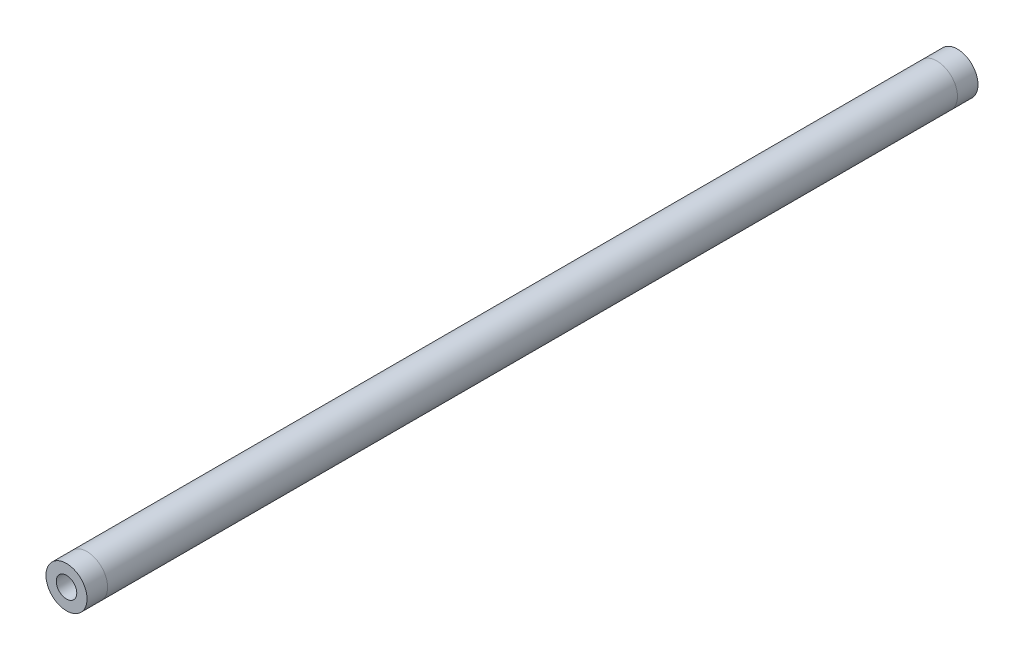
ISO-10303-21;
HEADER;
FILE_DESCRIPTION(('STEP AP214'),'2;1');
FILE_NAME('part.step','',(''),(''),'','','');
FILE_SCHEMA(('AUTOMOTIVE_DESIGN { 1 0 10303 214 1 1 1 1 }'));
ENDSEC;
DATA;
#1=APPLICATION_CONTEXT('core data for automotive mechanical design processes');
#2=APPLICATION_PROTOCOL_DEFINITION('international standard','automotive_design',2000,#1);
#3=PRODUCT_CONTEXT('',#1,'mechanical');
#4=PRODUCT('Part','Part','',(#3));
#5=PRODUCT_RELATED_PRODUCT_CATEGORY('part','',(#4));
#6=PRODUCT_DEFINITION_FORMATION('','',#4);
#7=PRODUCT_DEFINITION_CONTEXT('part definition',#1,'design');
#8=PRODUCT_DEFINITION('design','',#6,#7);
#9=PRODUCT_DEFINITION_SHAPE('','',#8);
#10=(LENGTH_UNIT() NAMED_UNIT(*) SI_UNIT(.MILLI.,.METRE.));
#11=(NAMED_UNIT(*) PLANE_ANGLE_UNIT() SI_UNIT($,.RADIAN.));
#12=(NAMED_UNIT(*) SI_UNIT($,.STERADIAN.) SOLID_ANGLE_UNIT());
#13=UNCERTAINTY_MEASURE_WITH_UNIT(LENGTH_MEASURE(1.E-05),#10,'distance_accuracy_value','');
#14=(GEOMETRIC_REPRESENTATION_CONTEXT(3) GLOBAL_UNCERTAINTY_ASSIGNED_CONTEXT((#13)) GLOBAL_UNIT_ASSIGNED_CONTEXT((#10,
#11,#12)) REPRESENTATION_CONTEXT('',''));
#15=CARTESIAN_POINT('',(0.,0.,0.));
#16=DIRECTION('',(0.,0.,1.));
#17=DIRECTION('',(1.,0.,0.));
#18=AXIS2_PLACEMENT_3D('',#15,#16,#17);
#19=CARTESIAN_POINT('',(0.,0.,-275.389417953208));
#20=DIRECTION('',(0.,0.,1.));
#21=DIRECTION('',(1.,0.,0.));
#22=AXIS2_PLACEMENT_3D('',#19,#20,#21);
#23=CYLINDRICAL_SURFACE('',#22,6.35);
#24=CARTESIAN_POINT('',(0.,0.,-275.389417953208));
#25=DIRECTION('',(0.,0.,1.));
#26=DIRECTION('',(1.,0.,0.));
#27=AXIS2_PLACEMENT_3D('',#24,#25,#26);
#28=CIRCLE('',#27,6.35);
#29=CARTESIAN_POINT('',(6.35,0.,-275.389417953208));
#30=VERTEX_POINT('',#29);
#31=EDGE_CURVE('E85',#30,#30,#28,.T.);
#32=ORIENTED_EDGE('',*,*,#31,.T.);
#33=EDGE_LOOP('',(#32));
#34=FACE_BOUND('',#33,.T.);
#35=CARTESIAN_POINT('',(0.,0.,-269.039417953208));
#36=DIRECTION('',(0.,0.,1.));
#37=DIRECTION('',(1.,0.,0.));
#38=AXIS2_PLACEMENT_3D('',#35,#36,#37);
#39=CIRCLE('',#38,6.35);
#40=CARTESIAN_POINT('',(6.35,0.,-269.039417953208));
#41=VERTEX_POINT('',#40);
#42=EDGE_CURVE('E81',#41,#41,#39,.T.);
#43=ORIENTED_EDGE('',*,*,#42,.F.);
#44=EDGE_LOOP('',(#43));
#45=FACE_BOUND('',#44,.T.);
#46=ADVANCED_FACE('F78',(#34,#45),#23,.T.);
#47=CARTESIAN_POINT('',(0.,0.,-275.389417953208));
#48=DIRECTION('',(0.,0.,1.));
#49=DIRECTION('',(1.,0.,0.));
#50=AXIS2_PLACEMENT_3D('',#47,#48,#49);
#51=PLANE('',#50);
#52=CARTESIAN_POINT('',(0.,0.,-275.389417953208));
#53=DIRECTION('',(0.,0.,1.));
#54=DIRECTION('',(1.,0.,0.));
#55=AXIS2_PLACEMENT_3D('',#52,#53,#54);
#56=CIRCLE('',#55,3.175);
#57=CARTESIAN_POINT('',(3.175,0.,-275.389417953208));
#58=VERTEX_POINT('',#57);
#59=EDGE_CURVE('E94',#58,#58,#56,.T.);
#60=ORIENTED_EDGE('',*,*,#59,.T.);
#61=EDGE_LOOP('',(#60));
#62=FACE_BOUND('',#61,.T.);
#63=ORIENTED_EDGE('',*,*,#31,.F.);
#64=EDGE_LOOP('',(#63));
#65=FACE_BOUND('',#64,.T.);
#66=ADVANCED_FACE('F121',(#62,#65),#51,.F.);
#67=CARTESIAN_POINT('',(0.,0.,-269.039417953208));
#68=DIRECTION('',(0.,0.,1.));
#69=DIRECTION('',(1.,0.,0.));
#70=AXIS2_PLACEMENT_3D('',#67,#68,#69);
#71=PLANE('',#70);
#72=CARTESIAN_POINT('',(0.,0.,-269.039417953208));
#73=DIRECTION('',(0.,0.,1.));
#74=DIRECTION('',(1.,0.,0.));
#75=AXIS2_PLACEMENT_3D('',#72,#73,#74);
#76=CIRCLE('',#75,4.8514);
#77=CARTESIAN_POINT('',(-4.8514,0.,-269.039417953208));
#78=VERTEX_POINT('',#77);
#79=EDGE_CURVE('E12',#78,#78,#76,.T.);
#80=ORIENTED_EDGE('',*,*,#79,.F.);
#81=EDGE_LOOP('',(#80));
#82=FACE_BOUND('',#81,.T.);
#83=ORIENTED_EDGE('',*,*,#42,.T.);
#84=EDGE_LOOP('',(#83));
#85=FACE_BOUND('',#84,.T.);
#86=ADVANCED_FACE('F117',(#82,#85),#71,.T.);
#87=CARTESIAN_POINT('',(0.,0.,-275.389417953208));
#88=DIRECTION('',(0.,0.,1.));
#89=DIRECTION('',(1.,0.,0.));
#90=AXIS2_PLACEMENT_3D('',#87,#88,#89);
#91=CYLINDRICAL_SURFACE('',#90,3.175);
#92=ORIENTED_EDGE('',*,*,#59,.F.);
#93=EDGE_LOOP('',(#92));
#94=FACE_BOUND('',#93,.T.);
#95=CARTESIAN_POINT('',(0.,0.,-259.514417953208));
#96=DIRECTION('',(0.,0.,1.));
#97=DIRECTION('',(1.,0.,0.));
#98=AXIS2_PLACEMENT_3D('',#95,#96,#97);
#99=CIRCLE('',#98,3.175);
#100=CARTESIAN_POINT('',(3.175,0.,-259.514417953208));
#101=VERTEX_POINT('',#100);
#102=EDGE_CURVE('E100',#101,#101,#99,.T.);
#103=ORIENTED_EDGE('',*,*,#102,.T.);
#104=EDGE_LOOP('',(#103));
#105=FACE_BOUND('',#104,.T.);
#106=ADVANCED_FACE('F106',(#94,#105),#91,.F.);
#107=CARTESIAN_POINT('',(0.,0.,-259.514417953208));
#108=DIRECTION('',(0.,0.,1.));
#109=DIRECTION('',(1.,0.,0.));
#110=AXIS2_PLACEMENT_3D('',#107,#108,#109);
#111=PLANE('',#110);
#112=CARTESIAN_POINT('',(0.,0.,-259.514417953208));
#113=DIRECTION('',(0.,0.,1.));
#114=DIRECTION('',(1.,0.,0.));
#115=AXIS2_PLACEMENT_3D('',#112,#113,#114);
#116=CIRCLE('',#115,4.8514);
#117=CARTESIAN_POINT('',(-4.8514,0.,-259.514417953208));
#118=VERTEX_POINT('',#117);
#119=EDGE_CURVE('E92',#118,#118,#116,.T.);
#120=ORIENTED_EDGE('',*,*,#119,.T.);
#121=EDGE_LOOP('',(#120));
#122=FACE_BOUND('',#121,.T.);
#123=ORIENTED_EDGE('',*,*,#102,.F.);
#124=EDGE_LOOP('',(#123));
#125=FACE_BOUND('',#124,.T.);
#126=ADVANCED_FACE('F108',(#122,#125),#111,.T.);
#127=CARTESIAN_POINT('',(0.,0.,-259.514417953208));
#128=DIRECTION('',(0.,0.,-1.));
#129=DIRECTION('',(-1.,0.,0.));
#130=AXIS2_PLACEMENT_3D('',#127,#128,#129);
#131=CYLINDRICAL_SURFACE('',#130,4.8514);
#132=CARTESIAN_POINT('',(-4.8514,0.,-259.514417953208));
#133=CARTESIAN_POINT('',(-4.8514,0.,-259.613636703208));
#134=CARTESIAN_POINT('',(-4.8514,0.,-259.712855453208));
#135=CARTESIAN_POINT('',(-4.8514,0.,-259.911292953208));
#136=CARTESIAN_POINT('',(-4.8514,0.,-260.010511703208));
#137=CARTESIAN_POINT('',(-4.8514,0.,-260.208949203208));
#138=CARTESIAN_POINT('',(-4.8514,0.,-260.308167953208));
#139=CARTESIAN_POINT('',(-4.8514,0.,-260.506605453208));
#140=CARTESIAN_POINT('',(-4.8514,0.,-260.605824203208));
#141=CARTESIAN_POINT('',(-4.8514,0.,-260.804261703208));
#142=CARTESIAN_POINT('',(-4.8514,0.,-260.903480453208));
#143=CARTESIAN_POINT('',(-4.8514,0.,-261.101917953208));
#144=CARTESIAN_POINT('',(-4.8514,0.,-261.201136703208));
#145=CARTESIAN_POINT('',(-4.8514,0.,-261.399574203208));
#146=CARTESIAN_POINT('',(-4.8514,0.,-261.498792953208));
#147=CARTESIAN_POINT('',(-4.8514,0.,-261.697230453208));
#148=CARTESIAN_POINT('',(-4.8514,0.,-261.796449203208));
#149=CARTESIAN_POINT('',(-4.8514,0.,-261.994886703208));
#150=CARTESIAN_POINT('',(-4.8514,0.,-262.094105453208));
#151=CARTESIAN_POINT('',(-4.8514,0.,-262.292542953208));
#152=CARTESIAN_POINT('',(-4.8514,0.,-262.391761703208));
#153=CARTESIAN_POINT('',(-4.8514,0.,-262.590199203208));
#154=CARTESIAN_POINT('',(-4.8514,0.,-262.689417953208));
#155=CARTESIAN_POINT('',(-4.8514,0.,-262.887855453208));
#156=CARTESIAN_POINT('',(-4.8514,0.,-262.987074203208));
#157=CARTESIAN_POINT('',(-4.8514,0.,-263.185511703208));
#158=CARTESIAN_POINT('',(-4.8514,0.,-263.284730453208));
#159=CARTESIAN_POINT('',(-4.8514,0.,-263.483167953208));
#160=CARTESIAN_POINT('',(-4.8514,0.,-263.582386703208));
#161=CARTESIAN_POINT('',(-4.8514,0.,-263.780824203208));
#162=CARTESIAN_POINT('',(-4.8514,0.,-263.880042953208));
#163=CARTESIAN_POINT('',(-4.8514,0.,-264.078480453208));
#164=CARTESIAN_POINT('',(-4.8514,0.,-264.177699203208));
#165=CARTESIAN_POINT('',(-4.8514,0.,-264.376136703208));
#166=CARTESIAN_POINT('',(-4.8514,0.,-264.475355453208));
#167=CARTESIAN_POINT('',(-4.8514,0.,-264.673792953208));
#168=CARTESIAN_POINT('',(-4.8514,0.,-264.773011703208));
#169=CARTESIAN_POINT('',(-4.8514,0.,-264.971449203208));
#170=CARTESIAN_POINT('',(-4.8514,0.,-265.070667953208));
#171=CARTESIAN_POINT('',(-4.8514,0.,-265.269105453208));
#172=CARTESIAN_POINT('',(-4.8514,0.,-265.368324203208));
#173=CARTESIAN_POINT('',(-4.8514,0.,-265.566761703208));
#174=CARTESIAN_POINT('',(-4.8514,0.,-265.665980453208));
#175=CARTESIAN_POINT('',(-4.8514,0.,-265.864417953208));
#176=CARTESIAN_POINT('',(-4.8514,0.,-265.963636703208));
#177=CARTESIAN_POINT('',(-4.8514,0.,-266.162074203208));
#178=CARTESIAN_POINT('',(-4.8514,0.,-266.261292953208));
#179=CARTESIAN_POINT('',(-4.8514,0.,-266.459730453208));
#180=CARTESIAN_POINT('',(-4.8514,0.,-266.558949203208));
#181=CARTESIAN_POINT('',(-4.8514,0.,-266.757386703208));
#182=CARTESIAN_POINT('',(-4.8514,0.,-266.856605453208));
#183=CARTESIAN_POINT('',(-4.8514,0.,-267.055042953208));
#184=CARTESIAN_POINT('',(-4.8514,0.,-267.154261703208));
#185=CARTESIAN_POINT('',(-4.8514,0.,-267.352699203208));
#186=CARTESIAN_POINT('',(-4.8514,0.,-267.451917953208));
#187=CARTESIAN_POINT('',(-4.8514,0.,-267.650355453208));
#188=CARTESIAN_POINT('',(-4.8514,0.,-267.749574203208));
#189=CARTESIAN_POINT('',(-4.8514,0.,-267.948011703208));
#190=CARTESIAN_POINT('',(-4.8514,0.,-268.047230453208));
#191=CARTESIAN_POINT('',(-4.8514,0.,-268.245667953208));
#192=CARTESIAN_POINT('',(-4.8514,0.,-268.344886703208));
#193=CARTESIAN_POINT('',(-4.8514,0.,-268.543324203208));
#194=CARTESIAN_POINT('',(-4.8514,0.,-268.642542953208));
#195=CARTESIAN_POINT('',(-4.8514,0.,-268.840980453208));
#196=CARTESIAN_POINT('',(-4.8514,0.,-268.940199203208));
#197=CARTESIAN_POINT('',(-4.8514,0.,-269.039417953208));
#198=B_SPLINE_CURVE_WITH_KNOTS('',3,(#132,#133,#134,#135,#136,#137,#138,#139,#140,#141,#142,
#143,#144,#145,#146,#147,#148,#149,#150,#151,#152,#153,#154,#155,#156,#157,#158,#159,#160,#161,
#162,#163,#164,#165,#166,#167,#168,#169,#170,#171,#172,#173,#174,#175,#176,#177,#178,#179,#180,
#181,#182,#183,#184,#185,#186,#187,#188,#189,#190,#191,#192,#193,#194,#195,#196,#197),
.UNSPECIFIED.,.F.,.F.,(4,2,2,2,2,2,2,2,2,2,2,2,2,2,2,2,2,2,2,2,2,2,2,2,2,2,2,2,2,2,2,2,4),(0.,
0.297656250000056,0.595312500000056,0.892968750000056,1.19062500000006,1.48828125000006,
1.78593750000006,2.08359375000006,2.38125000000006,2.67890625000006,2.97656250000006,
3.27421875000006,3.57187500000006,3.86953125000006,4.16718750000006,4.46484375000006,
4.76250000000006,5.06015625000006,5.35781250000006,5.65546875000006,5.95312500000006,
6.25078125000006,6.54843750000006,6.84609375000006,7.14375000000006,7.44140625000006,
7.73906250000006,8.03671875000006,8.33437500000006,8.63203125000006,8.92968750000006,
9.22734375000006,9.52500000000006),.UNSPECIFIED.);
#199=EDGE_CURVE('BSEAM110',#118,#78,#198,.T.);
#200=ORIENTED_EDGE('',*,*,#119,.F.);
#201=ORIENTED_EDGE('',*,*,#79,.T.);
#202=ORIENTED_EDGE('',*,*,#199,.T.);
#203=ORIENTED_EDGE('',*,*,#199,.F.);
#204=EDGE_LOOP('',(#200,#202,#201,#203));
#205=FACE_BOUND('',#204,.T.);
#206=ADVANCED_FACE('F110',(#205),#131,.T.);
#207=CLOSED_SHELL('',(#46,#66,#86,#106,#126,#206));
#208=MANIFOLD_SOLID_BREP('B2',#207);
#209=CARTESIAN_POINT('',(0.,0.,-269.039417953208));
#210=DIRECTION('',(0.,0.,1.));
#211=DIRECTION('',(1.,0.,0.));
#212=AXIS2_PLACEMENT_3D('',#209,#210,#211);
#213=CYLINDRICAL_SURFACE('',#212,6.35);
#214=CARTESIAN_POINT('',(0.,0.,-269.039417953208));
#215=DIRECTION('',(0.,0.,1.));
#216=DIRECTION('',(1.,0.,0.));
#217=AXIS2_PLACEMENT_3D('',#214,#215,#216);
#218=CIRCLE('',#217,6.35);
#219=CARTESIAN_POINT('',(6.35,0.,-269.039417953208));
#220=VERTEX_POINT('',#219);
#221=EDGE_CURVE('E77',#220,#220,#218,.T.);
#222=ORIENTED_EDGE('',*,*,#221,.T.);
#223=EDGE_LOOP('',(#222));
#224=FACE_BOUND('',#223,.T.);
#225=CARTESIAN_POINT('',(0.,0.,-6.35));
#226=DIRECTION('',(0.,0.,1.));
#227=DIRECTION('',(1.,0.,0.));
#228=AXIS2_PLACEMENT_3D('',#225,#226,#227);
#229=CIRCLE('',#228,6.35);
#230=CARTESIAN_POINT('',(6.35,0.,-6.35));
#231=VERTEX_POINT('',#230);
#232=EDGE_CURVE('E193',#231,#231,#229,.T.);
#233=ORIENTED_EDGE('',*,*,#232,.F.);
#234=EDGE_LOOP('',(#233));
#235=FACE_BOUND('',#234,.T.);
#236=ADVANCED_FACE('F190',(#224,#235),#213,.T.);
#237=CARTESIAN_POINT('',(0.,0.,-269.039417953208));
#238=DIRECTION('',(0.,0.,1.));
#239=DIRECTION('',(1.,0.,0.));
#240=AXIS2_PLACEMENT_3D('',#237,#238,#239);
#241=PLANE('',#240);
#242=CARTESIAN_POINT('',(0.,0.,-269.039417953208));
#243=DIRECTION('',(0.,0.,1.));
#244=DIRECTION('',(1.,0.,0.));
#245=AXIS2_PLACEMENT_3D('',#242,#243,#244);
#246=CIRCLE('',#245,4.8514);
#247=CARTESIAN_POINT('',(4.8514,0.,-269.039417953208));
#248=VERTEX_POINT('',#247);
#249=EDGE_CURVE('E200',#248,#248,#246,.T.);
#250=ORIENTED_EDGE('',*,*,#249,.T.);
#251=EDGE_LOOP('',(#250));
#252=FACE_BOUND('',#251,.T.);
#253=ORIENTED_EDGE('',*,*,#221,.F.);
#254=EDGE_LOOP('',(#253));
#255=FACE_BOUND('',#254,.T.);
#256=ADVANCED_FACE('F208',(#252,#255),#241,.F.);
#257=CARTESIAN_POINT('',(0.,0.,-6.35));
#258=DIRECTION('',(0.,0.,1.));
#259=DIRECTION('',(1.,0.,0.));
#260=AXIS2_PLACEMENT_3D('',#257,#258,#259);
#261=PLANE('',#260);
#262=CARTESIAN_POINT('',(0.,0.,-6.35));
#263=DIRECTION('',(0.,0.,1.));
#264=DIRECTION('',(1.,0.,0.));
#265=AXIS2_PLACEMENT_3D('',#262,#263,#264);
#266=CIRCLE('',#265,4.8514);
#267=CARTESIAN_POINT('',(4.8514,0.,-6.35));
#268=VERTEX_POINT('',#267);
#269=EDGE_CURVE('E202',#268,#268,#266,.T.);
#270=ORIENTED_EDGE('',*,*,#269,.F.);
#271=EDGE_LOOP('',(#270));
#272=FACE_BOUND('',#271,.T.);
#273=ORIENTED_EDGE('',*,*,#232,.T.);
#274=EDGE_LOOP('',(#273));
#275=FACE_BOUND('',#274,.T.);
#276=ADVANCED_FACE('F214',(#272,#275),#261,.T.);
#277=CARTESIAN_POINT('',(0.,0.,-269.039417953208));
#278=DIRECTION('',(0.,0.,1.));
#279=DIRECTION('',(1.,0.,0.));
#280=AXIS2_PLACEMENT_3D('',#277,#278,#279);
#281=CYLINDRICAL_SURFACE('',#280,4.8514);
#282=ORIENTED_EDGE('',*,*,#249,.F.);
#283=EDGE_LOOP('',(#282));
#284=FACE_BOUND('',#283,.T.);
#285=ORIENTED_EDGE('',*,*,#269,.T.);
#286=EDGE_LOOP('',(#285));
#287=FACE_BOUND('',#286,.T.);
#288=ADVANCED_FACE('F211',(#284,#287),#281,.F.);
#289=CLOSED_SHELL('',(#236,#256,#276,#288));
#290=MANIFOLD_SOLID_BREP('B7',#289);
#291=CARTESIAN_POINT('',(0.,0.,-6.35));
#292=DIRECTION('',(0.,0.,1.));
#293=DIRECTION('',(1.,0.,0.));
#294=AXIS2_PLACEMENT_3D('',#291,#292,#293);
#295=CYLINDRICAL_SURFACE('',#294,6.35);
#296=CARTESIAN_POINT('',(0.,0.,-6.35));
#297=DIRECTION('',(0.,0.,1.));
#298=DIRECTION('',(1.,0.,0.));
#299=AXIS2_PLACEMENT_3D('',#296,#297,#298);
#300=CIRCLE('',#299,6.35);
#301=CARTESIAN_POINT('',(6.35,0.,-6.35));
#302=VERTEX_POINT('',#301);
#303=EDGE_CURVE('E189',#302,#302,#300,.T.);
#304=ORIENTED_EDGE('',*,*,#303,.T.);
#305=EDGE_LOOP('',(#304));
#306=FACE_BOUND('',#305,.T.);
#307=CARTESIAN_POINT('',(0.,0.,0.));
#308=DIRECTION('',(0.,0.,1.));
#309=DIRECTION('',(1.,0.,0.));
#310=AXIS2_PLACEMENT_3D('',#307,#308,#309);
#311=CIRCLE('',#310,6.35);
#312=CARTESIAN_POINT('',(6.35,0.,0.));
#313=VERTEX_POINT('',#312);
#314=EDGE_CURVE('E263',#313,#313,#311,.T.);
#315=ORIENTED_EDGE('',*,*,#314,.F.);
#316=EDGE_LOOP('',(#315));
#317=FACE_BOUND('',#316,.T.);
#318=ADVANCED_FACE('F252',(#306,#317),#295,.T.);
#319=CARTESIAN_POINT('',(0.,0.,-6.35));
#320=DIRECTION('',(0.,0.,1.));
#321=DIRECTION('',(1.,0.,0.));
#322=AXIS2_PLACEMENT_3D('',#319,#320,#321);
#323=CYLINDRICAL_SURFACE('',#322,3.175);
#324=CARTESIAN_POINT('',(0.,0.,0.));
#325=DIRECTION('',(0.,0.,1.));
#326=DIRECTION('',(1.,0.,0.));
#327=AXIS2_PLACEMENT_3D('',#324,#325,#326);
#328=CIRCLE('',#327,3.175);
#329=CARTESIAN_POINT('',(3.175,0.,0.));
#330=VERTEX_POINT('',#329);
#331=EDGE_CURVE('E255',#330,#330,#328,.T.);
#332=ORIENTED_EDGE('',*,*,#331,.T.);
#333=EDGE_LOOP('',(#332));
#334=FACE_BOUND('',#333,.T.);
#335=CARTESIAN_POINT('',(0.,0.,-15.875));
#336=DIRECTION('',(0.,0.,1.));
#337=DIRECTION('',(1.,0.,0.));
#338=AXIS2_PLACEMENT_3D('',#335,#336,#337);
#339=CIRCLE('',#338,3.175);
#340=CARTESIAN_POINT('',(3.175,0.,-15.875));
#341=VERTEX_POINT('',#340);
#342=EDGE_CURVE('E275',#341,#341,#339,.T.);
#343=ORIENTED_EDGE('',*,*,#342,.F.);
#344=EDGE_LOOP('',(#343));
#345=FACE_BOUND('',#344,.T.);
#346=ADVANCED_FACE('F283',(#334,#345),#323,.F.);
#347=CARTESIAN_POINT('',(0.,0.,-6.35));
#348=DIRECTION('',(0.,0.,1.));
#349=DIRECTION('',(1.,0.,0.));
#350=AXIS2_PLACEMENT_3D('',#347,#348,#349);
#351=PLANE('',#350);
#352=CARTESIAN_POINT('',(0.,0.,-6.35));
#353=DIRECTION('',(0.,0.,1.));
#354=DIRECTION('',(1.,0.,0.));
#355=AXIS2_PLACEMENT_3D('',#352,#353,#354);
#356=CIRCLE('',#355,4.8514);
#357=CARTESIAN_POINT('',(4.8514,0.,-6.35));
#358=VERTEX_POINT('',#357);
#359=EDGE_CURVE('E265',#358,#358,#356,.T.);
#360=ORIENTED_EDGE('',*,*,#359,.T.);
#361=EDGE_LOOP('',(#360));
#362=FACE_BOUND('',#361,.T.);
#363=ORIENTED_EDGE('',*,*,#303,.F.);
#364=EDGE_LOOP('',(#363));
#365=FACE_BOUND('',#364,.T.);
#366=ADVANCED_FACE('F285',(#362,#365),#351,.F.);
#367=CARTESIAN_POINT('',(0.,0.,0.));
#368=DIRECTION('',(0.,0.,1.));
#369=DIRECTION('',(1.,0.,0.));
#370=AXIS2_PLACEMENT_3D('',#367,#368,#369);
#371=PLANE('',#370);
#372=ORIENTED_EDGE('',*,*,#314,.T.);
#373=EDGE_LOOP('',(#372));
#374=FACE_BOUND('',#373,.T.);
#375=ORIENTED_EDGE('',*,*,#331,.F.);
#376=EDGE_LOOP('',(#375));
#377=FACE_BOUND('',#376,.T.);
#378=ADVANCED_FACE('F291',(#374,#377),#371,.T.);
#379=CARTESIAN_POINT('',(0.,0.,-15.875));
#380=DIRECTION('',(0.,0.,1.));
#381=DIRECTION('',(1.,0.,0.));
#382=AXIS2_PLACEMENT_3D('',#379,#380,#381);
#383=CYLINDRICAL_SURFACE('',#382,4.8514);
#384=CARTESIAN_POINT('',(0.,0.,-15.875));
#385=DIRECTION('',(0.,0.,1.));
#386=DIRECTION('',(1.,0.,0.));
#387=AXIS2_PLACEMENT_3D('',#384,#385,#386);
#388=CIRCLE('',#387,4.8514);
#389=CARTESIAN_POINT('',(4.8514,0.,-15.875));
#390=VERTEX_POINT('',#389);
#391=EDGE_CURVE('E268',#390,#390,#388,.T.);
#392=CARTESIAN_POINT('',(4.8514,0.,-15.875));
#393=CARTESIAN_POINT('',(4.8514,0.,-15.77578125));
#394=CARTESIAN_POINT('',(4.8514,0.,-15.6765625));
#395=CARTESIAN_POINT('',(4.8514,0.,-15.478125));
#396=CARTESIAN_POINT('',(4.8514,0.,-15.37890625));
#397=CARTESIAN_POINT('',(4.8514,0.,-15.18046875));
#398=CARTESIAN_POINT('',(4.8514,0.,-15.08125));
#399=CARTESIAN_POINT('',(4.8514,0.,-14.8828125));
#400=CARTESIAN_POINT('',(4.8514,0.,-14.78359375));
#401=CARTESIAN_POINT('',(4.8514,0.,-14.58515625));
#402=CARTESIAN_POINT('',(4.8514,0.,-14.4859375));
#403=CARTESIAN_POINT('',(4.8514,0.,-14.2875));
#404=CARTESIAN_POINT('',(4.8514,0.,-14.18828125));
#405=CARTESIAN_POINT('',(4.8514,0.,-13.98984375));
#406=CARTESIAN_POINT('',(4.8514,0.,-13.890625));
#407=CARTESIAN_POINT('',(4.8514,0.,-13.6921875));
#408=CARTESIAN_POINT('',(4.8514,0.,-13.59296875));
#409=CARTESIAN_POINT('',(4.8514,0.,-13.39453125));
#410=CARTESIAN_POINT('',(4.8514,0.,-13.2953125));
#411=CARTESIAN_POINT('',(4.8514,0.,-13.096875));
#412=CARTESIAN_POINT('',(4.8514,0.,-12.99765625));
#413=CARTESIAN_POINT('',(4.8514,0.,-12.79921875));
#414=CARTESIAN_POINT('',(4.8514,0.,-12.7));
#415=CARTESIAN_POINT('',(4.8514,0.,-12.5015625));
#416=CARTESIAN_POINT('',(4.8514,0.,-12.40234375));
#417=CARTESIAN_POINT('',(4.8514,0.,-12.20390625));
#418=CARTESIAN_POINT('',(4.8514,0.,-12.1046875));
#419=CARTESIAN_POINT('',(4.8514,0.,-11.90625));
#420=CARTESIAN_POINT('',(4.8514,0.,-11.80703125));
#421=CARTESIAN_POINT('',(4.8514,0.,-11.60859375));
#422=CARTESIAN_POINT('',(4.8514,0.,-11.509375));
#423=CARTESIAN_POINT('',(4.8514,0.,-11.3109375));
#424=CARTESIAN_POINT('',(4.8514,0.,-11.21171875));
#425=CARTESIAN_POINT('',(4.8514,0.,-11.01328125));
#426=CARTESIAN_POINT('',(4.8514,0.,-10.9140625));
#427=CARTESIAN_POINT('',(4.8514,0.,-10.715625));
#428=CARTESIAN_POINT('',(4.8514,0.,-10.61640625));
#429=CARTESIAN_POINT('',(4.8514,0.,-10.41796875));
#430=CARTESIAN_POINT('',(4.8514,0.,-10.31875));
#431=CARTESIAN_POINT('',(4.8514,0.,-10.1203125));
#432=CARTESIAN_POINT('',(4.8514,0.,-10.02109375));
#433=CARTESIAN_POINT('',(4.8514,0.,-9.82265625));
#434=CARTESIAN_POINT('',(4.8514,0.,-9.7234375));
#435=CARTESIAN_POINT('',(4.8514,0.,-9.525));
#436=CARTESIAN_POINT('',(4.8514,0.,-9.42578125));
#437=CARTESIAN_POINT('',(4.8514,0.,-9.22734375));
#438=CARTESIAN_POINT('',(4.8514,0.,-9.128125));
#439=CARTESIAN_POINT('',(4.8514,0.,-8.9296875));
#440=CARTESIAN_POINT('',(4.8514,0.,-8.83046875));
#441=CARTESIAN_POINT('',(4.8514,0.,-8.63203125));
#442=CARTESIAN_POINT('',(4.8514,0.,-8.5328125));
#443=CARTESIAN_POINT('',(4.8514,0.,-8.334375));
#444=CARTESIAN_POINT('',(4.8514,0.,-8.23515625));
#445=CARTESIAN_POINT('',(4.8514,0.,-8.03671875));
#446=CARTESIAN_POINT('',(4.8514,0.,-7.9375));
#447=CARTESIAN_POINT('',(4.8514,0.,-7.7390625));
#448=CARTESIAN_POINT('',(4.8514,0.,-7.63984375));
#449=CARTESIAN_POINT('',(4.8514,0.,-7.44140625));
#450=CARTESIAN_POINT('',(4.8514,0.,-7.3421875));
#451=CARTESIAN_POINT('',(4.8514,0.,-7.14375));
#452=CARTESIAN_POINT('',(4.8514,0.,-7.04453125));
#453=CARTESIAN_POINT('',(4.8514,0.,-6.84609375));
#454=CARTESIAN_POINT('',(4.8514,0.,-6.746875));
#455=CARTESIAN_POINT('',(4.8514,0.,-6.5484375));
#456=CARTESIAN_POINT('',(4.8514,0.,-6.44921875));
#457=CARTESIAN_POINT('',(4.8514,0.,-6.35));
#458=B_SPLINE_CURVE_WITH_KNOTS('',3,(#392,#393,#394,#395,#396,#397,#398,#399,#400,#401,#402,
#403,#404,#405,#406,#407,#408,#409,#410,#411,#412,#413,#414,#415,#416,#417,#418,#419,#420,#421,
#422,#423,#424,#425,#426,#427,#428,#429,#430,#431,#432,#433,#434,#435,#436,#437,#438,#439,#440,
#441,#442,#443,#444,#445,#446,#447,#448,#449,#450,#451,#452,#453,#454,#455,#456,#457),
.UNSPECIFIED.,.F.,.F.,(4,2,2,2,2,2,2,2,2,2,2,2,2,2,2,2,2,2,2,2,2,2,2,2,2,2,2,2,2,2,2,2,4),(0.,
0.297656250000002,0.595312500000002,0.892968750000002,1.190625,1.48828125,1.7859375,2.08359375,
2.38125,2.67890625,2.9765625,3.27421875,3.571875,3.86953125,4.1671875,4.46484375,4.7625,
5.06015625,5.3578125,5.65546875,5.953125,6.25078125,6.5484375,6.84609375,7.14375,7.44140625,
7.7390625,8.03671875,8.334375,8.63203125,8.9296875,9.22734375,9.525),.UNSPECIFIED.);
#459=EDGE_CURVE('BSEAM296',#390,#358,#458,.T.);
#460=ORIENTED_EDGE('',*,*,#391,.T.);
#461=ORIENTED_EDGE('',*,*,#359,.F.);
#462=ORIENTED_EDGE('',*,*,#459,.T.);
#463=ORIENTED_EDGE('',*,*,#459,.F.);
#464=EDGE_LOOP('',(#460,#462,#461,#463));
#465=FACE_BOUND('',#464,.T.);
#466=ADVANCED_FACE('F296',(#465),#383,.T.);
#467=CARTESIAN_POINT('',(0.,0.,-15.875));
#468=DIRECTION('',(0.,0.,1.));
#469=DIRECTION('',(1.,0.,0.));
#470=AXIS2_PLACEMENT_3D('',#467,#468,#469);
#471=PLANE('',#470);
#472=ORIENTED_EDGE('',*,*,#342,.T.);
#473=EDGE_LOOP('',(#472));
#474=FACE_BOUND('',#473,.T.);
#475=ORIENTED_EDGE('',*,*,#391,.F.);
#476=EDGE_LOOP('',(#475));
#477=FACE_BOUND('',#476,.T.);
#478=ADVANCED_FACE('F280',(#474,#477),#471,.F.);
#479=CLOSED_SHELL('',(#318,#346,#366,#378,#466,#478));
#480=MANIFOLD_SOLID_BREP('B72',#479);
#481=ADVANCED_BREP_SHAPE_REPRESENTATION('',(#18,#208,#290,#480),#14);
#482=SHAPE_DEFINITION_REPRESENTATION(#9,#481);
ENDSEC;
END-ISO-10303-21;
